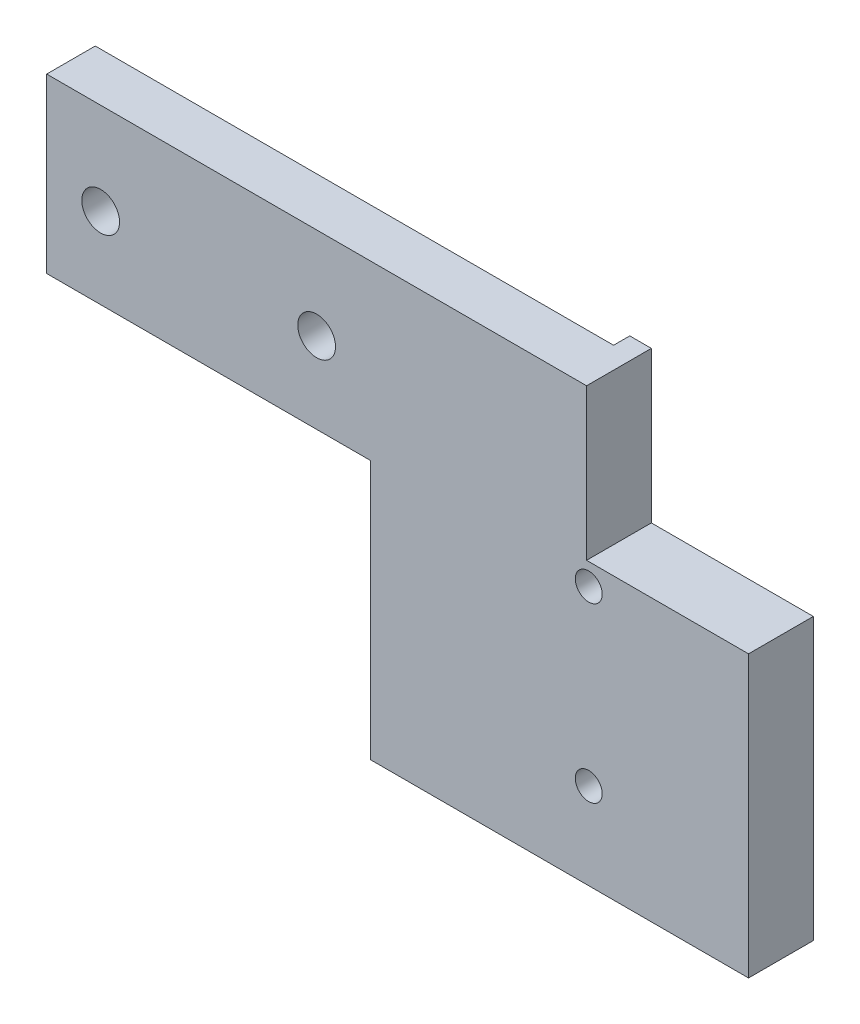
ISO-10303-21;
HEADER;
FILE_DESCRIPTION(('STEP AP214'),'2;1');
FILE_NAME('part.step','',(''),(''),'','','');
FILE_SCHEMA(('AUTOMOTIVE_DESIGN { 1 0 10303 214 1 1 1 1 }'));
ENDSEC;
DATA;
#1=APPLICATION_CONTEXT('core data for automotive mechanical design processes');
#2=APPLICATION_PROTOCOL_DEFINITION('international standard','automotive_design',2000,#1);
#3=PRODUCT_CONTEXT('',#1,'mechanical');
#4=PRODUCT('Part','Part','',(#3));
#5=PRODUCT_RELATED_PRODUCT_CATEGORY('part','',(#4));
#6=PRODUCT_DEFINITION_FORMATION('','',#4);
#7=PRODUCT_DEFINITION_CONTEXT('part definition',#1,'design');
#8=PRODUCT_DEFINITION('design','',#6,#7);
#9=PRODUCT_DEFINITION_SHAPE('','',#8);
#10=(LENGTH_UNIT() NAMED_UNIT(*) SI_UNIT(.MILLI.,.METRE.));
#11=(NAMED_UNIT(*) PLANE_ANGLE_UNIT() SI_UNIT($,.RADIAN.));
#12=(NAMED_UNIT(*) SI_UNIT($,.STERADIAN.) SOLID_ANGLE_UNIT());
#13=UNCERTAINTY_MEASURE_WITH_UNIT(LENGTH_MEASURE(1.E-05),#10,'distance_accuracy_value','');
#14=(GEOMETRIC_REPRESENTATION_CONTEXT(3) GLOBAL_UNCERTAINTY_ASSIGNED_CONTEXT((#13)) GLOBAL_UNIT_ASSIGNED_CONTEXT((#10,
#11,#12)) REPRESENTATION_CONTEXT('',''));
#15=CARTESIAN_POINT('',(0.,0.,0.));
#16=DIRECTION('',(0.,0.,1.));
#17=DIRECTION('',(1.,0.,0.));
#18=AXIS2_PLACEMENT_3D('',#15,#16,#17);
#19=CARTESIAN_POINT('',(0.,0.,6.));
#20=DIRECTION('',(1.,0.,0.));
#21=DIRECTION('',(0.,0.,-1.));
#22=AXIS2_PLACEMENT_3D('',#19,#20,#21);
#23=PLANE('',#22);
#24=DIRECTION('',(0.,1.,0.));
#25=VECTOR('',#24,1.);
#26=CARTESIAN_POINT('',(0.,0.,1.5));
#27=LINE('',#26,#25);
#28=CARTESIAN_POINT('',(0.,24.,1.5));
#29=VERTEX_POINT('',#28);
#30=CARTESIAN_POINT('',(0.,40.,1.5));
#31=VERTEX_POINT('',#30);
#32=EDGE_CURVE('E202',#29,#31,#27,.T.);
#33=ORIENTED_EDGE('',*,*,#32,.F.);
#34=DIRECTION('',(0.,0.,1.));
#35=VECTOR('',#34,1.);
#36=CARTESIAN_POINT('',(0.,24.,-4.));
#37=LINE('',#36,#35);
#38=CARTESIAN_POINT('',(0.,24.,6.));
#39=VERTEX_POINT('',#38);
#40=EDGE_CURVE('E176',#29,#39,#37,.T.);
#41=ORIENTED_EDGE('',*,*,#40,.T.);
#42=DIRECTION('',(0.,-1.,0.));
#43=VECTOR('',#42,1.);
#44=CARTESIAN_POINT('',(0.,0.,6.));
#45=LINE('',#44,#43);
#46=CARTESIAN_POINT('',(0.,40.,6.));
#47=VERTEX_POINT('',#46);
#48=EDGE_CURVE('E133',#47,#39,#45,.T.);
#49=ORIENTED_EDGE('',*,*,#48,.F.);
#50=DIRECTION('',(0.,0.,-1.));
#51=VECTOR('',#50,1.);
#52=CARTESIAN_POINT('',(0.,40.,6.));
#53=LINE('',#52,#51);
#54=EDGE_CURVE('E144',#47,#31,#53,.T.);
#55=ORIENTED_EDGE('',*,*,#54,.T.);
#56=EDGE_LOOP('',(#33,#41,#49,#55));
#57=FACE_BOUND('',#56,.T.);
#58=ADVANCED_FACE('F33',(#57),#23,.F.);
#59=CARTESIAN_POINT('',(0.,0.,6.));
#60=DIRECTION('',(0.,1.,0.));
#61=DIRECTION('',(0.,0.,1.));
#62=AXIS2_PLACEMENT_3D('',#59,#60,#61);
#63=PLANE('',#62);
#64=DIRECTION('',(1.,0.,0.));
#65=VECTOR('',#64,1.);
#66=CARTESIAN_POINT('',(0.,0.,6.));
#67=LINE('',#66,#65);
#68=CARTESIAN_POINT('',(30.,0.,6.));
#69=VERTEX_POINT('',#68);
#70=CARTESIAN_POINT('',(65.,0.,6.));
#71=VERTEX_POINT('',#70);
#72=EDGE_CURVE('E137',#69,#71,#67,.T.);
#73=ORIENTED_EDGE('',*,*,#72,.F.);
#74=DIRECTION('',(0.,0.,1.));
#75=VECTOR('',#74,1.);
#76=CARTESIAN_POINT('',(30.,0.,-4.));
#77=LINE('',#76,#75);
#78=CARTESIAN_POINT('',(30.,0.,1.5));
#79=VERTEX_POINT('',#78);
#80=EDGE_CURVE('E167',#79,#69,#77,.T.);
#81=ORIENTED_EDGE('',*,*,#80,.F.);
#82=DIRECTION('',(1.,0.,0.));
#83=VECTOR('',#82,1.);
#84=CARTESIAN_POINT('',(0.,0.,1.5));
#85=LINE('',#84,#83);
#86=CARTESIAN_POINT('',(48.,0.,1.5));
#87=VERTEX_POINT('',#86);
#88=EDGE_CURVE('E164',#79,#87,#85,.T.);
#89=ORIENTED_EDGE('',*,*,#88,.T.);
#90=DIRECTION('',(0.,0.,-1.));
#91=VECTOR('',#90,1.);
#92=CARTESIAN_POINT('',(48.,0.,0.));
#93=LINE('',#92,#91);
#94=CARTESIAN_POINT('',(48.,0.,0.));
#95=VERTEX_POINT('',#94);
#96=EDGE_CURVE('E199',#87,#95,#93,.T.);
#97=ORIENTED_EDGE('',*,*,#96,.T.);
#98=DIRECTION('',(1.,0.,0.));
#99=VECTOR('',#98,1.);
#100=CARTESIAN_POINT('',(0.,0.,0.));
#101=LINE('',#100,#99);
#102=CARTESIAN_POINT('',(65.,0.,0.));
#103=VERTEX_POINT('',#102);
#104=EDGE_CURVE('E140',#95,#103,#101,.T.);
#105=ORIENTED_EDGE('',*,*,#104,.T.);
#106=DIRECTION('',(0.,0.,-1.));
#107=VECTOR('',#106,1.);
#108=CARTESIAN_POINT('',(65.,0.,6.));
#109=LINE('',#108,#107);
#110=EDGE_CURVE('E147',#71,#103,#109,.T.);
#111=ORIENTED_EDGE('',*,*,#110,.F.);
#112=EDGE_LOOP('',(#73,#81,#89,#97,#105,#111));
#113=FACE_BOUND('',#112,.T.);
#114=ADVANCED_FACE('F171',(#113),#63,.F.);
#115=CARTESIAN_POINT('',(65.,0.,6.));
#116=DIRECTION('',(-1.,0.,0.));
#117=DIRECTION('',(0.,0.,1.));
#118=AXIS2_PLACEMENT_3D('',#115,#116,#117);
#119=PLANE('',#118);
#120=DIRECTION('',(0.,1.,0.));
#121=VECTOR('',#120,1.);
#122=CARTESIAN_POINT('',(65.,0.,0.));
#123=LINE('',#122,#121);
#124=CARTESIAN_POINT('',(65.,26.,0.));
#125=VERTEX_POINT('',#124);
#126=EDGE_CURVE('E134',#103,#125,#123,.T.);
#127=ORIENTED_EDGE('',*,*,#126,.T.);
#128=DIRECTION('',(0.,0.,1.));
#129=VECTOR('',#128,1.);
#130=CARTESIAN_POINT('',(65.,26.,0.));
#131=LINE('',#130,#129);
#132=CARTESIAN_POINT('',(65.,26.,6.));
#133=VERTEX_POINT('',#132);
#134=EDGE_CURVE('E225',#125,#133,#131,.T.);
#135=ORIENTED_EDGE('',*,*,#134,.T.);
#136=DIRECTION('',(0.,1.,0.));
#137=VECTOR('',#136,1.);
#138=CARTESIAN_POINT('',(65.,0.,6.));
#139=LINE('',#138,#137);
#140=EDGE_CURVE('E211',#71,#133,#139,.T.);
#141=ORIENTED_EDGE('',*,*,#140,.F.);
#142=ORIENTED_EDGE('',*,*,#110,.T.);
#143=EDGE_LOOP('',(#127,#135,#141,#142));
#144=FACE_BOUND('',#143,.T.);
#145=ADVANCED_FACE('F218',(#144),#119,.F.);
#146=CARTESIAN_POINT('',(0.,40.,6.));
#147=DIRECTION('',(0.,-1.,0.));
#148=DIRECTION('',(0.,0.,-1.));
#149=AXIS2_PLACEMENT_3D('',#146,#147,#148);
#150=PLANE('',#149);
#151=DIRECTION('',(-1.,0.,0.));
#152=VECTOR('',#151,1.);
#153=CARTESIAN_POINT('',(0.,40.,6.));
#154=LINE('',#153,#152);
#155=CARTESIAN_POINT('',(50.,40.,6.));
#156=VERTEX_POINT('',#155);
#157=EDGE_CURVE('E126',#156,#47,#154,.T.);
#158=ORIENTED_EDGE('',*,*,#157,.F.);
#159=DIRECTION('',(0.,0.,1.));
#160=VECTOR('',#159,1.);
#161=CARTESIAN_POINT('',(50.,40.,0.));
#162=LINE('',#161,#160);
#163=CARTESIAN_POINT('',(50.,40.,0.));
#164=VERTEX_POINT('',#163);
#165=EDGE_CURVE('E112',#164,#156,#162,.T.);
#166=ORIENTED_EDGE('',*,*,#165,.F.);
#167=DIRECTION('',(-1.,0.,0.));
#168=VECTOR('',#167,1.);
#169=CARTESIAN_POINT('',(0.,40.,0.));
#170=LINE('',#169,#168);
#171=CARTESIAN_POINT('',(48.,40.,0.));
#172=VERTEX_POINT('',#171);
#173=EDGE_CURVE('E123',#164,#172,#170,.T.);
#174=ORIENTED_EDGE('',*,*,#173,.T.);
#175=DIRECTION('',(0.,0.,-1.));
#176=VECTOR('',#175,1.);
#177=CARTESIAN_POINT('',(48.,40.,0.));
#178=LINE('',#177,#176);
#179=CARTESIAN_POINT('',(48.,40.,1.5));
#180=VERTEX_POINT('',#179);
#181=EDGE_CURVE('E200',#180,#172,#178,.T.);
#182=ORIENTED_EDGE('',*,*,#181,.F.);
#183=DIRECTION('',(1.,0.,0.));
#184=VECTOR('',#183,1.);
#185=CARTESIAN_POINT('',(0.,40.,1.5));
#186=LINE('',#185,#184);
#187=EDGE_CURVE('E153',#31,#180,#186,.T.);
#188=ORIENTED_EDGE('',*,*,#187,.F.);
#189=ORIENTED_EDGE('',*,*,#54,.F.);
#190=EDGE_LOOP('',(#158,#166,#174,#182,#188,#189));
#191=FACE_BOUND('',#190,.T.);
#192=ADVANCED_FACE('F121',(#191),#150,.F.);
#193=CARTESIAN_POINT('',(0.,40.,6.));
#194=DIRECTION('',(0.,0.,-1.));
#195=DIRECTION('',(-1.,0.,0.));
#196=AXIS2_PLACEMENT_3D('',#193,#194,#195);
#197=PLANE('',#196);
#198=CARTESIAN_POINT('',(50.2,8.,6.));
#199=DIRECTION('',(0.,0.,1.));
#200=DIRECTION('',(1.,0.,0.));
#201=AXIS2_PLACEMENT_3D('',#198,#199,#200);
#202=CIRCLE('',#201,1.24999999999999);
#203=CARTESIAN_POINT('',(51.45,8.,6.));
#204=VERTEX_POINT('',#203);
#205=EDGE_CURVE('E182',#204,#204,#202,.T.);
#206=ORIENTED_EDGE('',*,*,#205,.F.);
#207=EDGE_LOOP('',(#206));
#208=FACE_BOUND('',#207,.T.);
#209=CARTESIAN_POINT('',(50.2,24.,6.));
#210=DIRECTION('',(0.,0.,1.));
#211=DIRECTION('',(1.,0.,0.));
#212=AXIS2_PLACEMENT_3D('',#209,#210,#211);
#213=CIRCLE('',#212,1.24999999999999);
#214=CARTESIAN_POINT('',(51.45,24.,6.));
#215=VERTEX_POINT('',#214);
#216=EDGE_CURVE('E188',#215,#215,#213,.T.);
#217=ORIENTED_EDGE('',*,*,#216,.F.);
#218=EDGE_LOOP('',(#217));
#219=FACE_BOUND('',#218,.T.);
#220=CARTESIAN_POINT('',(25.,31.5000000000001,6.));
#221=DIRECTION('',(0.,0.,1.));
#222=DIRECTION('',(1.,0.,0.));
#223=AXIS2_PLACEMENT_3D('',#220,#221,#222);
#224=CIRCLE('',#223,1.75);
#225=CARTESIAN_POINT('',(26.75,31.5000000000001,6.));
#226=VERTEX_POINT('',#225);
#227=EDGE_CURVE('E157',#226,#226,#224,.T.);
#228=ORIENTED_EDGE('',*,*,#227,.F.);
#229=EDGE_LOOP('',(#228));
#230=FACE_BOUND('',#229,.T.);
#231=CARTESIAN_POINT('',(5.00000000000004,31.5,6.));
#232=DIRECTION('',(0.,0.,1.));
#233=DIRECTION('',(1.,0.,0.));
#234=AXIS2_PLACEMENT_3D('',#231,#232,#233);
#235=CIRCLE('',#234,1.75);
#236=CARTESIAN_POINT('',(6.75000000000004,31.5,6.));
#237=VERTEX_POINT('',#236);
#238=EDGE_CURVE('E154',#237,#237,#235,.T.);
#239=ORIENTED_EDGE('',*,*,#238,.F.);
#240=EDGE_LOOP('',(#239));
#241=FACE_BOUND('',#240,.T.);
#242=ORIENTED_EDGE('',*,*,#140,.T.);
#243=DIRECTION('',(1.,0.,0.));
#244=VECTOR('',#243,1.);
#245=CARTESIAN_POINT('',(65.,26.,6.));
#246=LINE('',#245,#244);
#247=CARTESIAN_POINT('',(50.,26.,6.));
#248=VERTEX_POINT('',#247);
#249=EDGE_CURVE('E117',#248,#133,#246,.T.);
#250=ORIENTED_EDGE('',*,*,#249,.F.);
#251=DIRECTION('',(0.,-1.,0.));
#252=VECTOR('',#251,1.);
#253=CARTESIAN_POINT('',(50.,40.,6.));
#254=LINE('',#253,#252);
#255=EDGE_CURVE('E222',#156,#248,#254,.T.);
#256=ORIENTED_EDGE('',*,*,#255,.F.);
#257=ORIENTED_EDGE('',*,*,#157,.T.);
#258=ORIENTED_EDGE('',*,*,#48,.T.);
#259=DIRECTION('',(-1.,0.,0.));
#260=VECTOR('',#259,1.);
#261=CARTESIAN_POINT('',(0.,24.,6.));
#262=LINE('',#261,#260);
#263=CARTESIAN_POINT('',(30.,24.,6.));
#264=VERTEX_POINT('',#263);
#265=EDGE_CURVE('E174',#264,#39,#262,.T.);
#266=ORIENTED_EDGE('',*,*,#265,.F.);
#267=DIRECTION('',(0.,1.,0.));
#268=VECTOR('',#267,1.);
#269=CARTESIAN_POINT('',(30.,0.,6.));
#270=LINE('',#269,#268);
#271=EDGE_CURVE('E178',#69,#264,#270,.T.);
#272=ORIENTED_EDGE('',*,*,#271,.F.);
#273=ORIENTED_EDGE('',*,*,#72,.T.);
#274=EDGE_LOOP('',(#242,#250,#256,#257,#258,#266,#272,#273));
#275=FACE_BOUND('',#274,.T.);
#276=ADVANCED_FACE('F234',(#208,#219,#230,#241,#275),#197,.F.);
#277=CARTESIAN_POINT('',(0.,40.,0.));
#278=DIRECTION('',(0.,0.,-1.));
#279=DIRECTION('',(-1.,0.,0.));
#280=AXIS2_PLACEMENT_3D('',#277,#278,#279);
#281=PLANE('',#280);
#282=DIRECTION('',(1.,0.,0.));
#283=VECTOR('',#282,1.);
#284=CARTESIAN_POINT('',(65.,26.,0.));
#285=LINE('',#284,#283);
#286=CARTESIAN_POINT('',(50.,26.,0.));
#287=VERTEX_POINT('',#286);
#288=EDGE_CURVE('E47',#287,#125,#285,.T.);
#289=ORIENTED_EDGE('',*,*,#288,.T.);
#290=ORIENTED_EDGE('',*,*,#126,.F.);
#291=ORIENTED_EDGE('',*,*,#104,.F.);
#292=DIRECTION('',(0.,1.,0.));
#293=VECTOR('',#292,1.);
#294=CARTESIAN_POINT('',(48.,0.,0.));
#295=LINE('',#294,#293);
#296=EDGE_CURVE('E132',#95,#172,#295,.T.);
#297=ORIENTED_EDGE('',*,*,#296,.T.);
#298=ORIENTED_EDGE('',*,*,#173,.F.);
#299=DIRECTION('',(0.,-1.,0.));
#300=VECTOR('',#299,1.);
#301=CARTESIAN_POINT('',(50.,40.,0.));
#302=LINE('',#301,#300);
#303=EDGE_CURVE('E108',#164,#287,#302,.T.);
#304=ORIENTED_EDGE('',*,*,#303,.T.);
#305=EDGE_LOOP('',(#289,#290,#291,#297,#298,#304));
#306=FACE_BOUND('',#305,.T.);
#307=CARTESIAN_POINT('',(50.2,8.,0.));
#308=DIRECTION('',(0.,0.,1.));
#309=DIRECTION('',(1.,0.,0.));
#310=AXIS2_PLACEMENT_3D('',#307,#308,#309);
#311=CIRCLE('',#310,1.25);
#312=CARTESIAN_POINT('',(51.45,8.,0.));
#313=VERTEX_POINT('',#312);
#314=EDGE_CURVE('E185',#313,#313,#311,.T.);
#315=ORIENTED_EDGE('',*,*,#314,.T.);
#316=EDGE_LOOP('',(#315));
#317=FACE_BOUND('',#316,.T.);
#318=CARTESIAN_POINT('',(50.2,24.,0.));
#319=DIRECTION('',(0.,0.,1.));
#320=DIRECTION('',(1.,0.,0.));
#321=AXIS2_PLACEMENT_3D('',#318,#319,#320);
#322=CIRCLE('',#321,1.25);
#323=CARTESIAN_POINT('',(51.45,24.,0.));
#324=VERTEX_POINT('',#323);
#325=EDGE_CURVE('E191',#324,#324,#322,.T.);
#326=ORIENTED_EDGE('',*,*,#325,.T.);
#327=EDGE_LOOP('',(#326));
#328=FACE_BOUND('',#327,.T.);
#329=ADVANCED_FACE('F129',(#306,#317,#328),#281,.T.);
#330=CARTESIAN_POINT('',(48.,0.,0.));
#331=DIRECTION('',(1.,0.,0.));
#332=DIRECTION('',(0.,0.,-1.));
#333=AXIS2_PLACEMENT_3D('',#330,#331,#332);
#334=PLANE('',#333);
#335=ORIENTED_EDGE('',*,*,#181,.T.);
#336=ORIENTED_EDGE('',*,*,#296,.F.);
#337=ORIENTED_EDGE('',*,*,#96,.F.);
#338=DIRECTION('',(0.,1.,0.));
#339=VECTOR('',#338,1.);
#340=CARTESIAN_POINT('',(48.,0.,1.5));
#341=LINE('',#340,#339);
#342=EDGE_CURVE('E207',#87,#180,#341,.T.);
#343=ORIENTED_EDGE('',*,*,#342,.T.);
#344=EDGE_LOOP('',(#335,#336,#337,#343));
#345=FACE_BOUND('',#344,.T.);
#346=ADVANCED_FACE('F238',(#345),#334,.F.);
#347=CARTESIAN_POINT('',(0.,0.,1.5));
#348=DIRECTION('',(0.,0.,1.));
#349=DIRECTION('',(1.,0.,0.));
#350=AXIS2_PLACEMENT_3D('',#347,#348,#349);
#351=PLANE('',#350);
#352=CARTESIAN_POINT('',(25.,31.5000000000001,1.5));
#353=DIRECTION('',(0.,0.,1.));
#354=DIRECTION('',(1.,0.,0.));
#355=AXIS2_PLACEMENT_3D('',#352,#353,#354);
#356=CIRCLE('',#355,1.75);
#357=CARTESIAN_POINT('',(26.75,31.5000000000001,1.5));
#358=VERTEX_POINT('',#357);
#359=EDGE_CURVE('E155',#358,#358,#356,.T.);
#360=ORIENTED_EDGE('',*,*,#359,.T.);
#361=EDGE_LOOP('',(#360));
#362=FACE_BOUND('',#361,.T.);
#363=CARTESIAN_POINT('',(5.00000000000004,31.5,1.5));
#364=DIRECTION('',(0.,0.,1.));
#365=DIRECTION('',(1.,0.,0.));
#366=AXIS2_PLACEMENT_3D('',#363,#364,#365);
#367=CIRCLE('',#366,1.75);
#368=CARTESIAN_POINT('',(6.75000000000004,31.5,1.5));
#369=VERTEX_POINT('',#368);
#370=EDGE_CURVE('E150',#369,#369,#367,.T.);
#371=ORIENTED_EDGE('',*,*,#370,.T.);
#372=EDGE_LOOP('',(#371));
#373=FACE_BOUND('',#372,.T.);
#374=DIRECTION('',(0.,1.,0.));
#375=VECTOR('',#374,1.);
#376=CARTESIAN_POINT('',(30.,0.,1.5));
#377=LINE('',#376,#375);
#378=CARTESIAN_POINT('',(30.,24.,1.5));
#379=VERTEX_POINT('',#378);
#380=EDGE_CURVE('E40',#79,#379,#377,.T.);
#381=ORIENTED_EDGE('',*,*,#380,.T.);
#382=DIRECTION('',(-1.,0.,0.));
#383=VECTOR('',#382,1.);
#384=CARTESIAN_POINT('',(0.,24.,1.5));
#385=LINE('',#384,#383);
#386=EDGE_CURVE('E11',#379,#29,#385,.T.);
#387=ORIENTED_EDGE('',*,*,#386,.T.);
#388=ORIENTED_EDGE('',*,*,#32,.T.);
#389=ORIENTED_EDGE('',*,*,#187,.T.);
#390=ORIENTED_EDGE('',*,*,#342,.F.);
#391=ORIENTED_EDGE('',*,*,#88,.F.);
#392=EDGE_LOOP('',(#381,#387,#388,#389,#390,#391));
#393=FACE_BOUND('',#392,.T.);
#394=ADVANCED_FACE('F161',(#362,#373,#393),#351,.F.);
#395=CARTESIAN_POINT('',(5.00000000000004,31.5,6.));
#396=DIRECTION('',(0.,0.,1.));
#397=DIRECTION('',(1.,0.,0.));
#398=AXIS2_PLACEMENT_3D('',#395,#396,#397);
#399=CYLINDRICAL_SURFACE('',#398,1.75);
#400=ORIENTED_EDGE('',*,*,#238,.T.);
#401=EDGE_LOOP('',(#400));
#402=FACE_BOUND('',#401,.T.);
#403=ORIENTED_EDGE('',*,*,#370,.F.);
#404=EDGE_LOOP('',(#403));
#405=FACE_BOUND('',#404,.T.);
#406=ADVANCED_FACE('F245',(#402,#405),#399,.F.);
#407=CARTESIAN_POINT('',(25.,31.5000000000001,6.));
#408=DIRECTION('',(0.,0.,1.));
#409=DIRECTION('',(1.,0.,0.));
#410=AXIS2_PLACEMENT_3D('',#407,#408,#409);
#411=CYLINDRICAL_SURFACE('',#410,1.75);
#412=ORIENTED_EDGE('',*,*,#227,.T.);
#413=EDGE_LOOP('',(#412));
#414=FACE_BOUND('',#413,.T.);
#415=ORIENTED_EDGE('',*,*,#359,.F.);
#416=EDGE_LOOP('',(#415));
#417=FACE_BOUND('',#416,.T.);
#418=ADVANCED_FACE('F275',(#414,#417),#411,.F.);
#419=CARTESIAN_POINT('',(50.2,24.,6.));
#420=DIRECTION('',(0.,0.,1.));
#421=DIRECTION('',(1.,0.,0.));
#422=AXIS2_PLACEMENT_3D('',#419,#420,#421);
#423=CYLINDRICAL_SURFACE('',#422,1.24999999999999);
#424=ORIENTED_EDGE('',*,*,#325,.F.);
#425=EDGE_LOOP('',(#424));
#426=FACE_BOUND('',#425,.T.);
#427=ORIENTED_EDGE('',*,*,#216,.T.);
#428=EDGE_LOOP('',(#427));
#429=FACE_BOUND('',#428,.T.);
#430=ADVANCED_FACE('F281',(#426,#429),#423,.F.);
#431=CARTESIAN_POINT('',(50.2,8.,6.));
#432=DIRECTION('',(0.,0.,1.));
#433=DIRECTION('',(1.,0.,0.));
#434=AXIS2_PLACEMENT_3D('',#431,#432,#433);
#435=CYLINDRICAL_SURFACE('',#434,1.24999999999999);
#436=ORIENTED_EDGE('',*,*,#314,.F.);
#437=EDGE_LOOP('',(#436));
#438=FACE_BOUND('',#437,.T.);
#439=ORIENTED_EDGE('',*,*,#205,.T.);
#440=EDGE_LOOP('',(#439));
#441=FACE_BOUND('',#440,.T.);
#442=ADVANCED_FACE('F287',(#438,#441),#435,.F.);
#443=CARTESIAN_POINT('',(0.,24.,-4.));
#444=DIRECTION('',(0.,1.,0.));
#445=DIRECTION('',(0.,0.,1.));
#446=AXIS2_PLACEMENT_3D('',#443,#444,#445);
#447=PLANE('',#446);
#448=DIRECTION('',(0.,0.,1.));
#449=VECTOR('',#448,1.);
#450=CARTESIAN_POINT('',(30.,24.,-4.));
#451=LINE('',#450,#449);
#452=EDGE_CURVE('E55',#379,#264,#451,.T.);
#453=ORIENTED_EDGE('',*,*,#452,.T.);
#454=ORIENTED_EDGE('',*,*,#265,.T.);
#455=ORIENTED_EDGE('',*,*,#40,.F.);
#456=ORIENTED_EDGE('',*,*,#386,.F.);
#457=EDGE_LOOP('',(#453,#454,#455,#456));
#458=FACE_BOUND('',#457,.T.);
#459=ADVANCED_FACE('F291',(#458),#447,.F.);
#460=CARTESIAN_POINT('',(30.,0.,-4.));
#461=DIRECTION('',(1.,0.,0.));
#462=DIRECTION('',(0.,0.,-1.));
#463=AXIS2_PLACEMENT_3D('',#460,#461,#462);
#464=PLANE('',#463);
#465=ORIENTED_EDGE('',*,*,#80,.T.);
#466=ORIENTED_EDGE('',*,*,#271,.T.);
#467=ORIENTED_EDGE('',*,*,#452,.F.);
#468=ORIENTED_EDGE('',*,*,#380,.F.);
#469=EDGE_LOOP('',(#465,#466,#467,#468));
#470=FACE_BOUND('',#469,.T.);
#471=ADVANCED_FACE('F166',(#470),#464,.F.);
#472=CARTESIAN_POINT('',(65.,26.,0.));
#473=DIRECTION('',(0.,-1.,0.));
#474=DIRECTION('',(0.,0.,-1.));
#475=AXIS2_PLACEMENT_3D('',#472,#473,#474);
#476=PLANE('',#475);
#477=ORIENTED_EDGE('',*,*,#249,.T.);
#478=ORIENTED_EDGE('',*,*,#134,.F.);
#479=ORIENTED_EDGE('',*,*,#288,.F.);
#480=DIRECTION('',(0.,0.,1.));
#481=VECTOR('',#480,1.);
#482=CARTESIAN_POINT('',(50.,26.,0.));
#483=LINE('',#482,#481);
#484=EDGE_CURVE('E114',#287,#248,#483,.T.);
#485=ORIENTED_EDGE('',*,*,#484,.T.);
#486=EDGE_LOOP('',(#477,#478,#479,#485));
#487=FACE_BOUND('',#486,.T.);
#488=ADVANCED_FACE('F295',(#487),#476,.F.);
#489=CARTESIAN_POINT('',(50.,40.,0.));
#490=DIRECTION('',(-1.,0.,0.));
#491=DIRECTION('',(0.,0.,1.));
#492=AXIS2_PLACEMENT_3D('',#489,#490,#491);
#493=PLANE('',#492);
#494=ORIENTED_EDGE('',*,*,#255,.T.);
#495=ORIENTED_EDGE('',*,*,#484,.F.);
#496=ORIENTED_EDGE('',*,*,#303,.F.);
#497=ORIENTED_EDGE('',*,*,#165,.T.);
#498=EDGE_LOOP('',(#494,#495,#496,#497));
#499=FACE_BOUND('',#498,.T.);
#500=ADVANCED_FACE('F111',(#499),#493,.F.);
#501=CLOSED_SHELL('',(#58,#114,#145,#192,#276,#329,#346,#394,#406,#418,#430,#442,#459,#471,#488,#500));
#502=MANIFOLD_SOLID_BREP('B2',#501);
#503=ADVANCED_BREP_SHAPE_REPRESENTATION('',(#18,#502),#14);
#504=SHAPE_DEFINITION_REPRESENTATION(#9,#503);
ENDSEC;
END-ISO-10303-21;
